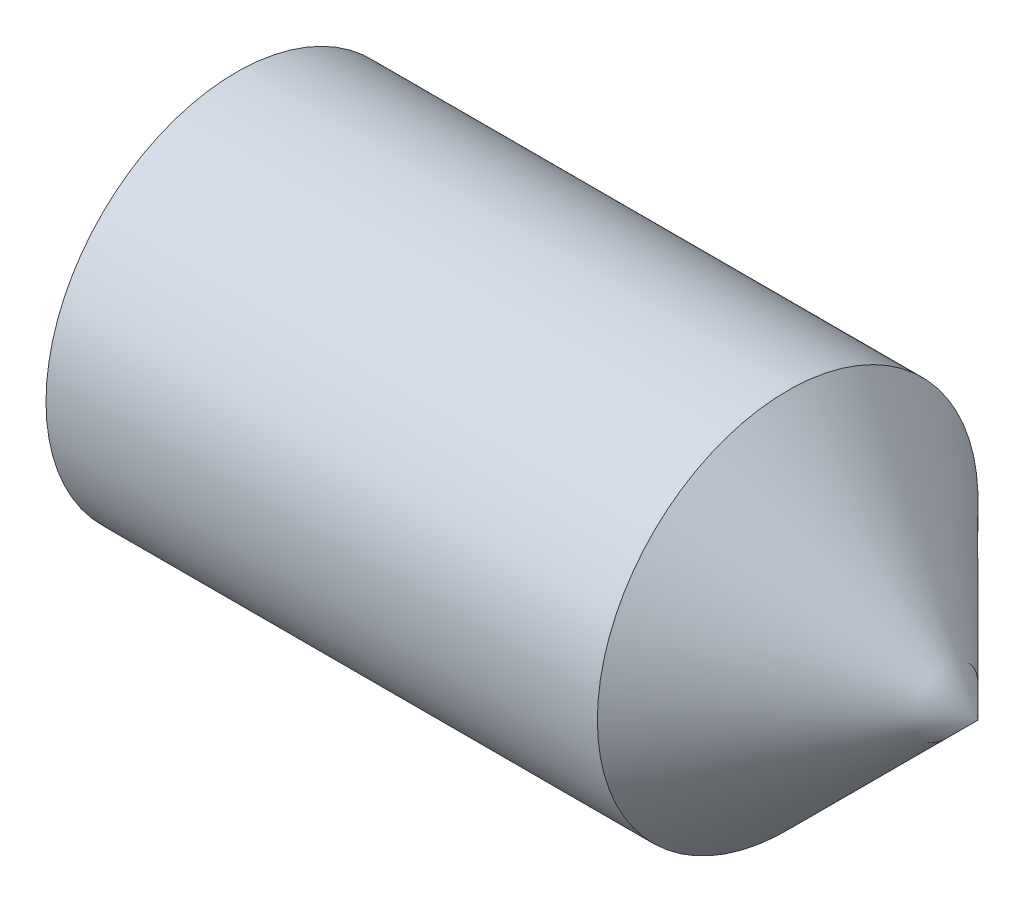
ISO-10303-21;
HEADER;
FILE_DESCRIPTION(('STEP AP214'),'2;1');
FILE_NAME('part.step','',(''),(''),'','','');
FILE_SCHEMA(('AUTOMOTIVE_DESIGN { 1 0 10303 214 1 1 1 1 }'));
ENDSEC;
DATA;
#1=APPLICATION_CONTEXT('core data for automotive mechanical design processes');
#2=APPLICATION_PROTOCOL_DEFINITION('international standard','automotive_design',2000,#1);
#3=PRODUCT_CONTEXT('',#1,'mechanical');
#4=PRODUCT('Part','Part','',(#3));
#5=PRODUCT_RELATED_PRODUCT_CATEGORY('part','',(#4));
#6=PRODUCT_DEFINITION_FORMATION('','',#4);
#7=PRODUCT_DEFINITION_CONTEXT('part definition',#1,'design');
#8=PRODUCT_DEFINITION('design','',#6,#7);
#9=PRODUCT_DEFINITION_SHAPE('','',#8);
#10=(LENGTH_UNIT() NAMED_UNIT(*) SI_UNIT(.MILLI.,.METRE.));
#11=(NAMED_UNIT(*) PLANE_ANGLE_UNIT() SI_UNIT($,.RADIAN.));
#12=(NAMED_UNIT(*) SI_UNIT($,.STERADIAN.) SOLID_ANGLE_UNIT());
#13=UNCERTAINTY_MEASURE_WITH_UNIT(LENGTH_MEASURE(1.E-05),#10,'distance_accuracy_value','');
#14=(GEOMETRIC_REPRESENTATION_CONTEXT(3) GLOBAL_UNCERTAINTY_ASSIGNED_CONTEXT((#13)) GLOBAL_UNIT_ASSIGNED_CONTEXT((#10,
#11,#12)) REPRESENTATION_CONTEXT('',''));
#15=CARTESIAN_POINT('',(0.,0.,0.));
#16=DIRECTION('',(0.,0.,1.));
#17=DIRECTION('',(1.,0.,0.));
#18=AXIS2_PLACEMENT_3D('',#15,#16,#17);
#19=CARTESIAN_POINT('',(0.,0.,0.));
#20=DIRECTION('',(-1.,0.,0.));
#21=DIRECTION('',(0.,0.,1.));
#22=AXIS2_PLACEMENT_3D('',#19,#20,#21);
#23=PLANE('',#22);
#24=CARTESIAN_POINT('',(0.,0.,0.));
#25=DIRECTION('',(-1.,0.,0.));
#26=DIRECTION('',(0.,0.,1.));
#27=AXIS2_PLACEMENT_3D('',#24,#25,#26);
#28=CIRCLE('',#27,2.055);
#29=CARTESIAN_POINT('',(0.,0.,2.055));
#30=VERTEX_POINT('',#29);
#31=EDGE_CURVE('E11',#30,#30,#28,.T.);
#32=ORIENTED_EDGE('',*,*,#31,.T.);
#33=EDGE_LOOP('',(#32));
#34=FACE_BOUND('',#33,.T.);
#35=DIRECTION('',(0.,0.,-1.));
#36=VECTOR('',#35,1.);
#37=CARTESIAN_POINT('',(0.,1.25,0.72168783648703));
#38=LINE('',#37,#36);
#39=CARTESIAN_POINT('',(0.,1.25,0.72168783648703));
#40=VERTEX_POINT('',#39);
#41=CARTESIAN_POINT('',(0.,1.25,-0.721687836487035));
#42=VERTEX_POINT('',#41);
#43=EDGE_CURVE('E96',#40,#42,#38,.T.);
#44=ORIENTED_EDGE('',*,*,#43,.F.);
#45=DIRECTION('',(0.,-0.866025403784439,0.5));
#46=VECTOR('',#45,1.);
#47=CARTESIAN_POINT('',(0.,1.25,0.72168783648703));
#48=LINE('',#47,#46);
#49=CARTESIAN_POINT('',(0.,0.,1.44337567297406));
#50=VERTEX_POINT('',#49);
#51=EDGE_CURVE('E49',#40,#50,#48,.T.);
#52=ORIENTED_EDGE('',*,*,#51,.T.);
#53=DIRECTION('',(0.,0.866025403784439,0.5));
#54=VECTOR('',#53,1.);
#55=CARTESIAN_POINT('',(0.,-1.25,0.72168783648703));
#56=LINE('',#55,#54);
#57=CARTESIAN_POINT('',(0.,-1.25,0.72168783648703));
#58=VERTEX_POINT('',#57);
#59=EDGE_CURVE('E102',#58,#50,#56,.T.);
#60=ORIENTED_EDGE('',*,*,#59,.F.);
#61=DIRECTION('',(0.,0.,-1.));
#62=VECTOR('',#61,1.);
#63=CARTESIAN_POINT('',(0.,-1.25,0.72168783648703));
#64=LINE('',#63,#62);
#65=CARTESIAN_POINT('',(0.,-1.25,-0.721687836487035));
#66=VERTEX_POINT('',#65);
#67=EDGE_CURVE('E122',#58,#66,#64,.T.);
#68=ORIENTED_EDGE('',*,*,#67,.T.);
#69=DIRECTION('',(0.,0.866025403784439,-0.5));
#70=VECTOR('',#69,1.);
#71=CARTESIAN_POINT('',(0.,-1.25,-0.721687836487035));
#72=LINE('',#71,#70);
#73=CARTESIAN_POINT('',(0.,0.,-1.44337567297407));
#74=VERTEX_POINT('',#73);
#75=EDGE_CURVE('E125',#66,#74,#72,.T.);
#76=ORIENTED_EDGE('',*,*,#75,.T.);
#77=DIRECTION('',(0.,-0.866025403784439,-0.5));
#78=VECTOR('',#77,1.);
#79=CARTESIAN_POINT('',(0.,1.25,-0.721687836487035));
#80=LINE('',#79,#78);
#81=EDGE_CURVE('E128',#42,#74,#80,.T.);
#82=ORIENTED_EDGE('',*,*,#81,.F.);
#83=EDGE_LOOP('',(#44,#52,#60,#68,#76,#82));
#84=FACE_BOUND('',#83,.T.);
#85=ADVANCED_FACE('F35',(#34,#84),#23,.T.);
#86=CARTESIAN_POINT('',(0.,0.,0.));
#87=DIRECTION('',(1.,0.,0.));
#88=DIRECTION('',(0.,0.,-1.));
#89=AXIS2_PLACEMENT_3D('',#86,#87,#88);
#90=CONICAL_SURFACE('',#89,2.055,1.0471975511966);
#91=CARTESIAN_POINT('',(0.256920869789382,0.,0.));
#92=DIRECTION('',(-1.,0.,0.));
#93=DIRECTION('',(0.,0.,1.));
#94=AXIS2_PLACEMENT_3D('',#91,#92,#93);
#95=CIRCLE('',#94,2.5);
#96=CARTESIAN_POINT('',(0.256920869789382,0.,2.5));
#97=VERTEX_POINT('',#96);
#98=EDGE_CURVE('E42',#97,#97,#95,.T.);
#99=ORIENTED_EDGE('',*,*,#98,.T.);
#100=EDGE_LOOP('',(#99));
#101=FACE_BOUND('',#100,.T.);
#102=ORIENTED_EDGE('',*,*,#31,.F.);
#103=EDGE_LOOP('',(#102));
#104=FACE_BOUND('',#103,.T.);
#105=ADVANCED_FACE('F145',(#101,#104),#90,.T.);
#106=CARTESIAN_POINT('',(-12.7,0.,0.));
#107=DIRECTION('',(-1.,0.,0.));
#108=DIRECTION('',(0.,0.,1.));
#109=AXIS2_PLACEMENT_3D('',#106,#107,#108);
#110=CYLINDRICAL_SURFACE('',#109,2.5);
#111=CARTESIAN_POINT('',(7.50000000000001,0.,0.));
#112=DIRECTION('',(-1.,0.,0.));
#113=DIRECTION('',(0.,0.,1.));
#114=AXIS2_PLACEMENT_3D('',#111,#112,#113);
#115=CIRCLE('',#114,2.5);
#116=CARTESIAN_POINT('',(7.50000000000001,0.,2.5));
#117=VERTEX_POINT('',#116);
#118=EDGE_CURVE('E103',#117,#117,#115,.T.);
#119=ORIENTED_EDGE('',*,*,#118,.T.);
#120=EDGE_LOOP('',(#119));
#121=FACE_BOUND('',#120,.T.);
#122=ORIENTED_EDGE('',*,*,#98,.F.);
#123=EDGE_LOOP('',(#122));
#124=FACE_BOUND('',#123,.T.);
#125=ADVANCED_FACE('F148',(#121,#124),#110,.T.);
#126=CARTESIAN_POINT('',(7.50000000000001,0.,0.));
#127=DIRECTION('',(-1.,0.,0.));
#128=DIRECTION('',(0.,0.,1.));
#129=AXIS2_PLACEMENT_3D('',#126,#127,#128);
#130=CONICAL_SURFACE('',#129,2.5,0.78539816339745);
#131=CARTESIAN_POINT('',(10.,0.,0.));
#132=VERTEX_POINT('',#131);
#133=VERTEX_LOOP('',#132);
#134=FACE_BOUND('',#133,.T.);
#135=ORIENTED_EDGE('',*,*,#118,.F.);
#136=EDGE_LOOP('',(#135));
#137=FACE_BOUND('',#136,.T.);
#138=ADVANCED_FACE('F150',(#134,#137),#130,.T.);
#139=CARTESIAN_POINT('',(3.,1.25,0.72168783648703));
#140=DIRECTION('',(0.,-0.5,-0.866025403784439));
#141=DIRECTION('',(0.,0.866025403784439,-0.5));
#142=AXIS2_PLACEMENT_3D('',#139,#140,#141);
#143=PLANE('',#142);
#144=ORIENTED_EDGE('',*,*,#51,.F.);
#145=DIRECTION('',(-1.,0.,0.));
#146=VECTOR('',#145,1.);
#147=CARTESIAN_POINT('',(3.,1.25,0.72168783648703));
#148=LINE('',#147,#146);
#149=CARTESIAN_POINT('',(3.,1.25,0.72168783648703));
#150=VERTEX_POINT('',#149);
#151=EDGE_CURVE('E90',#150,#40,#148,.T.);
#152=ORIENTED_EDGE('',*,*,#151,.F.);
#153=DIRECTION('',(0.,-0.866025403784439,0.5));
#154=VECTOR('',#153,1.);
#155=CARTESIAN_POINT('',(3.,1.25,0.72168783648703));
#156=LINE('',#155,#154);
#157=CARTESIAN_POINT('',(3.,0.,1.44337567297406));
#158=VERTEX_POINT('',#157);
#159=EDGE_CURVE('E85',#150,#158,#156,.T.);
#160=ORIENTED_EDGE('',*,*,#159,.T.);
#161=DIRECTION('',(-1.,0.,0.));
#162=VECTOR('',#161,1.);
#163=CARTESIAN_POINT('',(3.,0.,1.44337567297406));
#164=LINE('',#163,#162);
#165=EDGE_CURVE('E88',#158,#50,#164,.T.);
#166=ORIENTED_EDGE('',*,*,#165,.T.);
#167=EDGE_LOOP('',(#144,#152,#160,#166));
#168=FACE_BOUND('',#167,.T.);
#169=ADVANCED_FACE('F87',(#168),#143,.T.);
#170=CARTESIAN_POINT('',(3.,-1.25,0.72168783648703));
#171=DIRECTION('',(0.,-0.5,0.866025403784439));
#172=DIRECTION('',(0.,-0.866025403784439,-0.5));
#173=AXIS2_PLACEMENT_3D('',#170,#171,#172);
#174=PLANE('',#173);
#175=ORIENTED_EDGE('',*,*,#59,.T.);
#176=ORIENTED_EDGE('',*,*,#165,.F.);
#177=DIRECTION('',(0.,0.866025403784439,0.5));
#178=VECTOR('',#177,1.);
#179=CARTESIAN_POINT('',(3.,-1.25,0.72168783648703));
#180=LINE('',#179,#178);
#181=CARTESIAN_POINT('',(3.,-1.25,0.72168783648703));
#182=VERTEX_POINT('',#181);
#183=EDGE_CURVE('E95',#182,#158,#180,.T.);
#184=ORIENTED_EDGE('',*,*,#183,.F.);
#185=DIRECTION('',(-1.,0.,0.));
#186=VECTOR('',#185,1.);
#187=CARTESIAN_POINT('',(3.,-1.25,0.72168783648703));
#188=LINE('',#187,#186);
#189=EDGE_CURVE('E104',#182,#58,#188,.T.);
#190=ORIENTED_EDGE('',*,*,#189,.T.);
#191=EDGE_LOOP('',(#175,#176,#184,#190));
#192=FACE_BOUND('',#191,.T.);
#193=ADVANCED_FACE('F100',(#192),#174,.F.);
#194=CARTESIAN_POINT('',(3.,-1.25,0.72168783648703));
#195=DIRECTION('',(0.,1.,0.));
#196=DIRECTION('',(0.,0.,1.));
#197=AXIS2_PLACEMENT_3D('',#194,#195,#196);
#198=PLANE('',#197);
#199=ORIENTED_EDGE('',*,*,#67,.F.);
#200=ORIENTED_EDGE('',*,*,#189,.F.);
#201=DIRECTION('',(0.,0.,-1.));
#202=VECTOR('',#201,1.);
#203=CARTESIAN_POINT('',(3.,-1.25,0.72168783648703));
#204=LINE('',#203,#202);
#205=CARTESIAN_POINT('',(3.,-1.25,-0.721687836487035));
#206=VERTEX_POINT('',#205);
#207=EDGE_CURVE('E109',#182,#206,#204,.T.);
#208=ORIENTED_EDGE('',*,*,#207,.T.);
#209=DIRECTION('',(-1.,0.,0.));
#210=VECTOR('',#209,1.);
#211=CARTESIAN_POINT('',(3.,-1.25,-0.721687836487035));
#212=LINE('',#211,#210);
#213=EDGE_CURVE('E138',#206,#66,#212,.T.);
#214=ORIENTED_EDGE('',*,*,#213,.T.);
#215=EDGE_LOOP('',(#199,#200,#208,#214));
#216=FACE_BOUND('',#215,.T.);
#217=ADVANCED_FACE('F178',(#216),#198,.T.);
#218=CARTESIAN_POINT('',(3.,-1.25,-0.721687836487035));
#219=DIRECTION('',(0.,0.5,0.866025403784439));
#220=DIRECTION('',(0.,-0.866025403784439,0.5));
#221=AXIS2_PLACEMENT_3D('',#218,#219,#220);
#222=PLANE('',#221);
#223=ORIENTED_EDGE('',*,*,#75,.F.);
#224=ORIENTED_EDGE('',*,*,#213,.F.);
#225=DIRECTION('',(0.,0.866025403784439,-0.5));
#226=VECTOR('',#225,1.);
#227=CARTESIAN_POINT('',(3.,-1.25,-0.721687836487035));
#228=LINE('',#227,#226);
#229=CARTESIAN_POINT('',(3.,0.,-1.44337567297407));
#230=VERTEX_POINT('',#229);
#231=EDGE_CURVE('E111',#206,#230,#228,.T.);
#232=ORIENTED_EDGE('',*,*,#231,.T.);
#233=DIRECTION('',(-1.,0.,0.));
#234=VECTOR('',#233,1.);
#235=CARTESIAN_POINT('',(3.,0.,-1.44337567297407));
#236=LINE('',#235,#234);
#237=EDGE_CURVE('E136',#230,#74,#236,.T.);
#238=ORIENTED_EDGE('',*,*,#237,.T.);
#239=EDGE_LOOP('',(#223,#224,#232,#238));
#240=FACE_BOUND('',#239,.T.);
#241=ADVANCED_FACE('F174',(#240),#222,.T.);
#242=CARTESIAN_POINT('',(3.,1.25,-0.721687836487035));
#243=DIRECTION('',(0.,0.5,-0.866025403784438));
#244=DIRECTION('',(0.,0.866025403784439,0.5));
#245=AXIS2_PLACEMENT_3D('',#242,#243,#244);
#246=PLANE('',#245);
#247=ORIENTED_EDGE('',*,*,#81,.T.);
#248=ORIENTED_EDGE('',*,*,#237,.F.);
#249=DIRECTION('',(0.,-0.866025403784439,-0.5));
#250=VECTOR('',#249,1.);
#251=CARTESIAN_POINT('',(3.,1.25,-0.721687836487035));
#252=LINE('',#251,#250);
#253=CARTESIAN_POINT('',(3.,1.25,-0.721687836487035));
#254=VERTEX_POINT('',#253);
#255=EDGE_CURVE('E115',#254,#230,#252,.T.);
#256=ORIENTED_EDGE('',*,*,#255,.F.);
#257=DIRECTION('',(-1.,0.,0.));
#258=VECTOR('',#257,1.);
#259=CARTESIAN_POINT('',(3.,1.25,-0.721687836487035));
#260=LINE('',#259,#258);
#261=EDGE_CURVE('E134',#254,#42,#260,.T.);
#262=ORIENTED_EDGE('',*,*,#261,.T.);
#263=EDGE_LOOP('',(#247,#248,#256,#262));
#264=FACE_BOUND('',#263,.T.);
#265=ADVANCED_FACE('F171',(#264),#246,.F.);
#266=CARTESIAN_POINT('',(3.,1.25,0.72168783648703));
#267=DIRECTION('',(0.,1.,0.));
#268=DIRECTION('',(0.,0.,1.));
#269=AXIS2_PLACEMENT_3D('',#266,#267,#268);
#270=PLANE('',#269);
#271=ORIENTED_EDGE('',*,*,#43,.T.);
#272=ORIENTED_EDGE('',*,*,#261,.F.);
#273=DIRECTION('',(0.,0.,-1.));
#274=VECTOR('',#273,1.);
#275=CARTESIAN_POINT('',(3.,1.25,0.72168783648703));
#276=LINE('',#275,#274);
#277=EDGE_CURVE('E118',#150,#254,#276,.T.);
#278=ORIENTED_EDGE('',*,*,#277,.F.);
#279=ORIENTED_EDGE('',*,*,#151,.T.);
#280=EDGE_LOOP('',(#271,#272,#278,#279));
#281=FACE_BOUND('',#280,.T.);
#282=ADVANCED_FACE('F167',(#281),#270,.F.);
#283=CARTESIAN_POINT('',(3.,1.25,0.72168783648703));
#284=DIRECTION('',(1.,0.,0.));
#285=DIRECTION('',(0.,0.,-1.));
#286=AXIS2_PLACEMENT_3D('',#283,#284,#285);
#287=PLANE('',#286);
#288=ORIENTED_EDGE('',*,*,#159,.F.);
#289=ORIENTED_EDGE('',*,*,#277,.T.);
#290=ORIENTED_EDGE('',*,*,#255,.T.);
#291=ORIENTED_EDGE('',*,*,#231,.F.);
#292=ORIENTED_EDGE('',*,*,#207,.F.);
#293=ORIENTED_EDGE('',*,*,#183,.T.);
#294=EDGE_LOOP('',(#288,#289,#290,#291,#292,#293));
#295=FACE_BOUND('',#294,.T.);
#296=ADVANCED_FACE('F107',(#295),#287,.F.);
#297=CLOSED_SHELL('',(#85,#105,#125,#138,#169,#193,#217,#241,#265,#282,#296));
#298=MANIFOLD_SOLID_BREP('B2',#297);
#299=ADVANCED_BREP_SHAPE_REPRESENTATION('',(#18,#298),#14);
#300=SHAPE_DEFINITION_REPRESENTATION(#9,#299);
ENDSEC;
END-ISO-10303-21;
